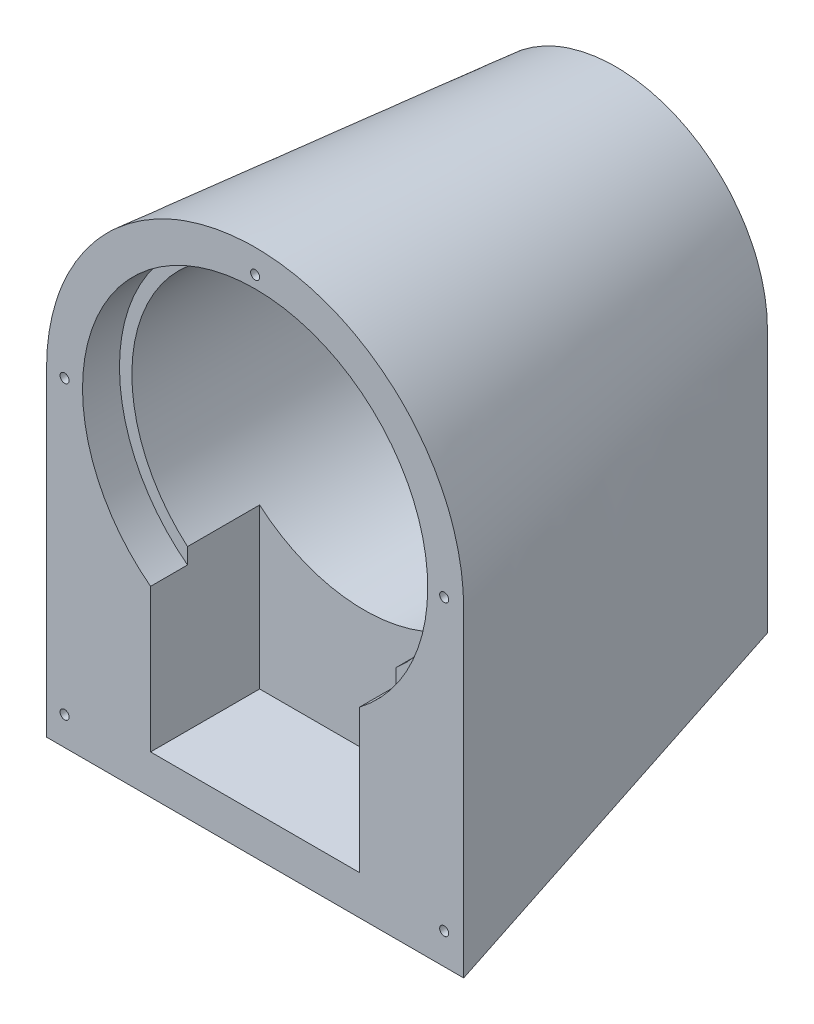
ISO-10303-21;
HEADER;
FILE_DESCRIPTION(('STEP AP214'),'2;1');
FILE_NAME('part.step','',(''),(''),'','','');
FILE_SCHEMA(('AUTOMOTIVE_DESIGN { 1 0 10303 214 1 1 1 1 }'));
ENDSEC;
DATA;
#1=APPLICATION_CONTEXT('core data for automotive mechanical design processes');
#2=APPLICATION_PROTOCOL_DEFINITION('international standard','automotive_design',2000,#1);
#3=PRODUCT_CONTEXT('',#1,'mechanical');
#4=PRODUCT('Part','Part','',(#3));
#5=PRODUCT_RELATED_PRODUCT_CATEGORY('part','',(#4));
#6=PRODUCT_DEFINITION_FORMATION('','',#4);
#7=PRODUCT_DEFINITION_CONTEXT('part definition',#1,'design');
#8=PRODUCT_DEFINITION('design','',#6,#7);
#9=PRODUCT_DEFINITION_SHAPE('','',#8);
#10=(LENGTH_UNIT() NAMED_UNIT(*) SI_UNIT(.MILLI.,.METRE.));
#11=(NAMED_UNIT(*) PLANE_ANGLE_UNIT() SI_UNIT($,.RADIAN.));
#12=(NAMED_UNIT(*) SI_UNIT($,.STERADIAN.) SOLID_ANGLE_UNIT());
#13=UNCERTAINTY_MEASURE_WITH_UNIT(LENGTH_MEASURE(1.E-05),#10,'distance_accuracy_value','');
#14=(GEOMETRIC_REPRESENTATION_CONTEXT(3) GLOBAL_UNCERTAINTY_ASSIGNED_CONTEXT((#13)) GLOBAL_UNIT_ASSIGNED_CONTEXT((#10,
#11,#12)) REPRESENTATION_CONTEXT('',''));
#15=CARTESIAN_POINT('',(0.,0.,0.));
#16=DIRECTION('',(0.,0.,1.));
#17=DIRECTION('',(1.,0.,0.));
#18=AXIS2_PLACEMENT_3D('',#15,#16,#17);
#19=CARTESIAN_POINT('',(0.,0.,-27.));
#20=DIRECTION('',(0.,0.,1.));
#21=DIRECTION('',(1.,0.,0.));
#22=AXIS2_PLACEMENT_3D('',#19,#20,#21);
#23=CYLINDRICAL_SURFACE('',#22,17.775);
#24=CARTESIAN_POINT('',(0.,0.,-4.1));
#25=DIRECTION('',(0.,0.,1.));
#26=DIRECTION('',(1.,0.,0.));
#27=AXIS2_PLACEMENT_3D('',#24,#25,#26);
#28=CIRCLE('',#27,17.775);
#29=CARTESIAN_POINT('',(-11.6,-13.4681336865952,-4.1));
#30=VERTEX_POINT('',#29);
#31=CARTESIAN_POINT('',(11.5397874396746,-13.519760754064,-4.1));
#32=VERTEX_POINT('',#31);
#33=EDGE_CURVE('E225',#30,#32,#28,.F.);
#34=ORIENTED_EDGE('',*,*,#33,.F.);
#35=DIRECTION('',(0.,0.,1.));
#36=VECTOR('',#35,1.);
#37=CARTESIAN_POINT('',(-11.6,-13.4681336865952,-27.));
#38=LINE('',#37,#36);
#39=CARTESIAN_POINT('',(-11.6,-13.4681336865952,-12.1));
#40=VERTEX_POINT('',#39);
#41=EDGE_CURVE('E205',#30,#40,#38,.F.);
#42=ORIENTED_EDGE('',*,*,#41,.T.);
#43=CARTESIAN_POINT('',(0.,0.,-12.1));
#44=DIRECTION('',(0.,0.,-1.));
#45=DIRECTION('',(-1.,0.,0.));
#46=AXIS2_PLACEMENT_3D('',#43,#44,#45);
#47=CIRCLE('',#46,17.775);
#48=CARTESIAN_POINT('',(11.5397874396746,-13.519760754064,-12.1));
#49=VERTEX_POINT('',#48);
#50=EDGE_CURVE('E11',#40,#49,#47,.F.);
#51=ORIENTED_EDGE('',*,*,#50,.T.);
#52=DIRECTION('',(0.,0.,1.));
#53=VECTOR('',#52,1.);
#54=CARTESIAN_POINT('',(11.5397874396746,-13.519760754064,-27.));
#55=LINE('',#54,#53);
#56=EDGE_CURVE('E202',#49,#32,#55,.T.);
#57=ORIENTED_EDGE('',*,*,#56,.T.);
#58=EDGE_LOOP('',(#34,#42,#51,#57));
#59=FACE_BOUND('',#58,.T.);
#60=CARTESIAN_POINT('',(0.,0.,-27.));
#61=DIRECTION('',(0.,0.,1.));
#62=DIRECTION('',(1.,0.,0.));
#63=AXIS2_PLACEMENT_3D('',#60,#61,#62);
#64=CIRCLE('',#63,17.775);
#65=CARTESIAN_POINT('',(17.775,0.,-27.));
#66=VERTEX_POINT('',#65);
#67=EDGE_CURVE('E271',#66,#66,#64,.T.);
#68=ORIENTED_EDGE('',*,*,#67,.F.);
#69=EDGE_LOOP('',(#68));
#70=FACE_BOUND('',#69,.T.);
#71=ADVANCED_FACE('F38',(#59,#70),#23,.F.);
#72=CARTESIAN_POINT('',(0.,0.,-39.));
#73=DIRECTION('',(0.,0.,-1.));
#74=DIRECTION('',(-1.,0.,0.));
#75=AXIS2_PLACEMENT_3D('',#72,#73,#74);
#76=PLANE('',#75);
#77=DIRECTION('',(0.,-1.,0.));
#78=VECTOR('',#77,1.);
#79=CARTESIAN_POINT('',(-4.5,2.5,-39.));
#80=LINE('',#79,#78);
#81=CARTESIAN_POINT('',(-4.5,2.5,-39.));
#82=VERTEX_POINT('',#81);
#83=CARTESIAN_POINT('',(-4.5,-1.5,-39.));
#84=VERTEX_POINT('',#83);
#85=EDGE_CURVE('E229',#82,#84,#80,.T.);
#86=ORIENTED_EDGE('',*,*,#85,.F.);
#87=DIRECTION('',(-1.,0.,0.));
#88=VECTOR('',#87,1.);
#89=CARTESIAN_POINT('',(9.1,2.5,-39.));
#90=LINE('',#89,#88);
#91=CARTESIAN_POINT('',(-9.1,2.5,-39.));
#92=VERTEX_POINT('',#91);
#93=EDGE_CURVE('E255',#82,#92,#90,.T.);
#94=ORIENTED_EDGE('',*,*,#93,.T.);
#95=DIRECTION('',(0.,-1.,0.));
#96=VECTOR('',#95,1.);
#97=CARTESIAN_POINT('',(-9.1,2.5,-39.));
#98=LINE('',#97,#96);
#99=CARTESIAN_POINT('',(-9.1,-2.5,-39.));
#100=VERTEX_POINT('',#99);
#101=EDGE_CURVE('E245',#92,#100,#98,.T.);
#102=ORIENTED_EDGE('',*,*,#101,.T.);
#103=DIRECTION('',(1.,0.,0.));
#104=VECTOR('',#103,1.);
#105=CARTESIAN_POINT('',(9.1,-2.5,-39.));
#106=LINE('',#105,#104);
#107=CARTESIAN_POINT('',(9.1,-2.5,-39.));
#108=VERTEX_POINT('',#107);
#109=EDGE_CURVE('E248',#100,#108,#106,.T.);
#110=ORIENTED_EDGE('',*,*,#109,.T.);
#111=DIRECTION('',(0.,1.,0.));
#112=VECTOR('',#111,1.);
#113=CARTESIAN_POINT('',(9.1,2.5,-39.));
#114=LINE('',#113,#112);
#115=CARTESIAN_POINT('',(9.1,2.5,-39.));
#116=VERTEX_POINT('',#115);
#117=EDGE_CURVE('E252',#108,#116,#114,.T.);
#118=ORIENTED_EDGE('',*,*,#117,.T.);
#119=CARTESIAN_POINT('',(4.5,2.5,-39.));
#120=VERTEX_POINT('',#119);
#121=EDGE_CURVE('E256',#116,#120,#90,.T.);
#122=ORIENTED_EDGE('',*,*,#121,.T.);
#123=DIRECTION('',(0.,1.,0.));
#124=VECTOR('',#123,1.);
#125=CARTESIAN_POINT('',(4.5,2.5,-39.));
#126=LINE('',#125,#124);
#127=CARTESIAN_POINT('',(4.5,-1.5,-39.));
#128=VERTEX_POINT('',#127);
#129=EDGE_CURVE('E233',#128,#120,#126,.T.);
#130=ORIENTED_EDGE('',*,*,#129,.F.);
#131=DIRECTION('',(1.,0.,0.));
#132=VECTOR('',#131,1.);
#133=CARTESIAN_POINT('',(4.5,-1.5,-39.));
#134=LINE('',#133,#132);
#135=EDGE_CURVE('E64',#84,#128,#134,.T.);
#136=ORIENTED_EDGE('',*,*,#135,.F.);
#137=EDGE_LOOP('',(#86,#94,#102,#110,#118,#122,#130,#136));
#138=FACE_BOUND('',#137,.T.);
#139=ADVANCED_FACE('F438',(#138),#76,.F.);
#140=CARTESIAN_POINT('',(0.,0.,0.));
#141=DIRECTION('',(0.,0.,1.));
#142=DIRECTION('',(1.,0.,0.));
#143=AXIS2_PLACEMENT_3D('',#140,#141,#142);
#144=PLANE('',#143);
#145=CARTESIAN_POINT('',(0.,20.5,0.));
#146=DIRECTION('',(0.,0.,1.));
#147=DIRECTION('',(1.,0.,0.));
#148=AXIS2_PLACEMENT_3D('',#145,#146,#147);
#149=CIRCLE('',#148,0.5);
#150=CARTESIAN_POINT('',(0.500000000000005,20.5,0.));
#151=VERTEX_POINT('',#150);
#152=EDGE_CURVE('E43',#151,#151,#149,.T.);
#153=ORIENTED_EDGE('',*,*,#152,.F.);
#154=EDGE_LOOP('',(#153));
#155=FACE_BOUND('',#154,.T.);
#156=CARTESIAN_POINT('',(-21.1408316826378,0.,0.));
#157=DIRECTION('',(0.,0.,1.));
#158=DIRECTION('',(1.,0.,0.));
#159=AXIS2_PLACEMENT_3D('',#156,#157,#158);
#160=CIRCLE('',#159,0.499999999999999);
#161=CARTESIAN_POINT('',(-20.6408316826378,0.,0.));
#162=VERTEX_POINT('',#161);
#163=EDGE_CURVE('E426',#162,#162,#160,.T.);
#164=ORIENTED_EDGE('',*,*,#163,.F.);
#165=EDGE_LOOP('',(#164));
#166=FACE_BOUND('',#165,.T.);
#167=CARTESIAN_POINT('',(20.9746954808096,0.,0.));
#168=DIRECTION('',(0.,0.,1.));
#169=DIRECTION('',(1.,0.,0.));
#170=AXIS2_PLACEMENT_3D('',#167,#168,#169);
#171=CIRCLE('',#170,0.499999999999999);
#172=CARTESIAN_POINT('',(21.4746954808096,0.,0.));
#173=VERTEX_POINT('',#172);
#174=EDGE_CURVE('E424',#173,#173,#171,.T.);
#175=ORIENTED_EDGE('',*,*,#174,.F.);
#176=EDGE_LOOP('',(#175));
#177=FACE_BOUND('',#176,.T.);
#178=CARTESIAN_POINT('',(-21.1408316826378,-32.3279733252439,0.));
#179=DIRECTION('',(0.,0.,1.));
#180=DIRECTION('',(1.,0.,0.));
#181=AXIS2_PLACEMENT_3D('',#178,#179,#180);
#182=CIRCLE('',#181,0.499999999999999);
#183=CARTESIAN_POINT('',(-20.6408316826378,-32.3279733252439,0.));
#184=VERTEX_POINT('',#183);
#185=EDGE_CURVE('E420',#184,#184,#182,.T.);
#186=ORIENTED_EDGE('',*,*,#185,.F.);
#187=EDGE_LOOP('',(#186));
#188=FACE_BOUND('',#187,.T.);
#189=CARTESIAN_POINT('',(20.9746954808096,-32.0642603339644,0.));
#190=DIRECTION('',(0.,0.,1.));
#191=DIRECTION('',(1.,0.,0.));
#192=AXIS2_PLACEMENT_3D('',#189,#190,#191);
#193=CIRCLE('',#192,0.499999999999999);
#194=CARTESIAN_POINT('',(21.4746954808096,-32.0642603339644,0.));
#195=VERTEX_POINT('',#194);
#196=EDGE_CURVE('E417',#195,#195,#193,.T.);
#197=ORIENTED_EDGE('',*,*,#196,.F.);
#198=EDGE_LOOP('',(#197));
#199=FACE_BOUND('',#198,.T.);
#200=DIRECTION('',(0.,-1.,0.));
#201=VECTOR('',#200,1.);
#202=CARTESIAN_POINT('',(-11.6,-15.2368796018082,0.));
#203=LINE('',#202,#201);
#204=CARTESIAN_POINT('',(-11.6,-15.2368796018082,0.));
#205=VERTEX_POINT('',#204);
#206=CARTESIAN_POINT('',(-11.6,-31.15,0.));
#207=VERTEX_POINT('',#206);
#208=EDGE_CURVE('E56',#205,#207,#203,.T.);
#209=ORIENTED_EDGE('',*,*,#208,.F.);
#210=CARTESIAN_POINT('',(0.,0.,0.));
#211=DIRECTION('',(0.,0.,1.));
#212=DIRECTION('',(1.,0.,0.));
#213=AXIS2_PLACEMENT_3D('',#210,#211,#212);
#214=CIRCLE('',#213,19.15);
#215=CARTESIAN_POINT('',(11.6,-15.2368796018082,0.));
#216=VERTEX_POINT('',#215);
#217=EDGE_CURVE('E210',#216,#205,#214,.T.);
#218=ORIENTED_EDGE('',*,*,#217,.F.);
#219=DIRECTION('',(0.,1.,0.));
#220=VECTOR('',#219,1.);
#221=CARTESIAN_POINT('',(11.6,-15.2368796018082,0.));
#222=LINE('',#221,#220);
#223=CARTESIAN_POINT('',(11.6,-31.15,0.));
#224=VERTEX_POINT('',#223);
#225=EDGE_CURVE('E218',#224,#216,#222,.T.);
#226=ORIENTED_EDGE('',*,*,#225,.F.);
#227=DIRECTION('',(1.,0.,0.));
#228=VECTOR('',#227,1.);
#229=CARTESIAN_POINT('',(11.6,-31.15,0.));
#230=LINE('',#229,#228);
#231=EDGE_CURVE('E216',#207,#224,#230,.T.);
#232=ORIENTED_EDGE('',*,*,#231,.F.);
#233=EDGE_LOOP('',(#209,#218,#226,#232));
#234=FACE_BOUND('',#233,.T.);
#235=DIRECTION('',(0.,1.,0.));
#236=VECTOR('',#235,1.);
#237=CARTESIAN_POINT('',(23.1391726111028,-35.5,0.));
#238=LINE('',#237,#236);
#239=CARTESIAN_POINT('',(23.1391726111028,-35.5,0.));
#240=VERTEX_POINT('',#239);
#241=CARTESIAN_POINT('',(23.1391726111028,3.593884949195E-11,0.));
#242=VERTEX_POINT('',#241);
#243=EDGE_CURVE('E391',#240,#242,#238,.T.);
#244=ORIENTED_EDGE('',*,*,#243,.T.);
#245=CARTESIAN_POINT('',(0.,0.,0.));
#246=DIRECTION('',(0.,0.,1.));
#247=DIRECTION('',(1.,0.,0.));
#248=AXIS2_PLACEMENT_3D('',#245,#246,#247);
#249=CIRCLE('',#248,23.1391726111028);
#250=CARTESIAN_POINT('',(-23.1391726111028,0.,0.));
#251=VERTEX_POINT('',#250);
#252=EDGE_CURVE('E385',#242,#251,#249,.T.);
#253=ORIENTED_EDGE('',*,*,#252,.T.);
#254=DIRECTION('',(0.,-1.,0.));
#255=VECTOR('',#254,1.);
#256=CARTESIAN_POINT('',(-23.1391726111028,0.,0.));
#257=LINE('',#256,#255);
#258=CARTESIAN_POINT('',(-23.1391726111028,-35.5,0.));
#259=VERTEX_POINT('',#258);
#260=EDGE_CURVE('E369',#251,#259,#257,.T.);
#261=ORIENTED_EDGE('',*,*,#260,.T.);
#262=DIRECTION('',(1.,0.,0.));
#263=VECTOR('',#262,1.);
#264=CARTESIAN_POINT('',(-23.1391726111028,-35.5,0.));
#265=LINE('',#264,#263);
#266=EDGE_CURVE('E365',#259,#240,#265,.T.);
#267=ORIENTED_EDGE('',*,*,#266,.T.);
#268=EDGE_LOOP('',(#244,#253,#261,#267));
#269=FACE_BOUND('',#268,.T.);
#270=ADVANCED_FACE('F40',(#155,#166,#177,#188,#199,#234,#269),#144,.T.);
#271=CARTESIAN_POINT('',(0.,3.66071428571428,-40.));
#272=DIRECTION('',(0.,0.,1.));
#273=DIRECTION('',(1.,0.,0.));
#274=AXIS2_PLACEMENT_3D('',#271,#272,#273);
#275=PLANE('',#274);
#276=DIRECTION('',(-1.,0.,0.));
#277=VECTOR('',#276,1.);
#278=CARTESIAN_POINT('',(0.,2.5,-40.));
#279=LINE('',#278,#277);
#280=CARTESIAN_POINT('',(4.5,2.5,-40.));
#281=VERTEX_POINT('',#280);
#282=CARTESIAN_POINT('',(-4.5,2.5,-40.));
#283=VERTEX_POINT('',#282);
#284=EDGE_CURVE('E410',#281,#283,#279,.T.);
#285=ORIENTED_EDGE('',*,*,#284,.T.);
#286=DIRECTION('',(0.,-1.,0.));
#287=VECTOR('',#286,1.);
#288=CARTESIAN_POINT('',(-4.5,3.66071428571428,-40.));
#289=LINE('',#288,#287);
#290=CARTESIAN_POINT('',(-4.5,-1.5,-40.));
#291=VERTEX_POINT('',#290);
#292=EDGE_CURVE('E48',#283,#291,#289,.T.);
#293=ORIENTED_EDGE('',*,*,#292,.T.);
#294=DIRECTION('',(1.,0.,0.));
#295=VECTOR('',#294,1.);
#296=CARTESIAN_POINT('',(0.,-1.5,-40.));
#297=LINE('',#296,#295);
#298=CARTESIAN_POINT('',(4.5,-1.5,-40.));
#299=VERTEX_POINT('',#298);
#300=EDGE_CURVE('E368',#291,#299,#297,.T.);
#301=ORIENTED_EDGE('',*,*,#300,.T.);
#302=DIRECTION('',(0.,1.,0.));
#303=VECTOR('',#302,1.);
#304=CARTESIAN_POINT('',(4.5,3.66071428571428,-40.));
#305=LINE('',#304,#303);
#306=EDGE_CURVE('E407',#299,#281,#305,.T.);
#307=ORIENTED_EDGE('',*,*,#306,.T.);
#308=EDGE_LOOP('',(#285,#293,#301,#307));
#309=FACE_BOUND('',#308,.T.);
#310=DIRECTION('',(1.,0.,0.));
#311=VECTOR('',#310,1.);
#312=CARTESIAN_POINT('',(-16.8392857142857,-25.5,-40.));
#313=LINE('',#312,#311);
#314=CARTESIAN_POINT('',(-16.8392857142857,-25.5,-40.));
#315=VERTEX_POINT('',#314);
#316=CARTESIAN_POINT('',(16.8392857142857,-25.5,-40.));
#317=VERTEX_POINT('',#316);
#318=EDGE_CURVE('E280',#315,#317,#313,.T.);
#319=ORIENTED_EDGE('',*,*,#318,.F.);
#320=DIRECTION('',(0.,-1.,0.));
#321=VECTOR('',#320,1.);
#322=CARTESIAN_POINT('',(-16.8392857142857,3.66071428571428,-40.));
#323=LINE('',#322,#321);
#324=CARTESIAN_POINT('',(-16.8392857142857,3.66071428571429,-40.));
#325=VERTEX_POINT('',#324);
#326=EDGE_CURVE('E285',#325,#315,#323,.T.);
#327=ORIENTED_EDGE('',*,*,#326,.F.);
#328=CARTESIAN_POINT('',(0.,3.66071428571428,-40.));
#329=DIRECTION('',(0.,0.,1.));
#330=DIRECTION('',(1.,0.,0.));
#331=AXIS2_PLACEMENT_3D('',#328,#329,#330);
#332=CIRCLE('',#331,16.8392857142857);
#333=CARTESIAN_POINT('',(16.8392857142857,3.66071428571428,-40.));
#334=VERTEX_POINT('',#333);
#335=EDGE_CURVE('E326',#334,#325,#332,.T.);
#336=ORIENTED_EDGE('',*,*,#335,.F.);
#337=DIRECTION('',(0.,1.,0.));
#338=VECTOR('',#337,1.);
#339=CARTESIAN_POINT('',(16.8392857142857,-25.5,-40.));
#340=LINE('',#339,#338);
#341=EDGE_CURVE('E345',#317,#334,#340,.T.);
#342=ORIENTED_EDGE('',*,*,#341,.F.);
#343=EDGE_LOOP('',(#319,#327,#336,#342));
#344=FACE_BOUND('',#343,.T.);
#345=ADVANCED_FACE('F304',(#309,#344),#275,.F.);
#346=CARTESIAN_POINT('',(-16.8392857142857,3.66071428571429,-40.));
#347=DIRECTION('',(-0.987823391647072,0.,-0.155579391035169));
#348=DIRECTION('',(0.,-1.,0.));
#349=AXIS2_PLACEMENT_3D('',#346,#347,#348);
#350=PLANE('',#349);
#351=ORIENTED_EDGE('',*,*,#326,.T.);
#352=DIRECTION('',(-0.151041745852426,-0.239753107200604,0.959012428802415));
#353=VECTOR('',#352,1.);
#354=CARTESIAN_POINT('',(-19.9892291626942,-30.5,-20.));
#355=LINE('',#354,#353);
#356=EDGE_CURVE('E846',#315,#259,#355,.T.);
#357=ORIENTED_EDGE('',*,*,#356,.T.);
#358=ORIENTED_EDGE('',*,*,#260,.F.);
#359=DIRECTION('',(0.154947502841091,0.0900363048537773,-0.983811331085177));
#360=VECTOR('',#359,1.);
#361=CARTESIAN_POINT('',(-19.9892291626942,1.83035714285714,-20.));
#362=LINE('',#361,#360);
#363=EDGE_CURVE('E291',#251,#325,#362,.T.);
#364=ORIENTED_EDGE('',*,*,#363,.T.);
#365=EDGE_LOOP('',(#351,#357,#358,#364));
#366=FACE_BOUND('',#365,.T.);
#367=ADVANCED_FACE('F293',(#366),#350,.T.);
#368=CARTESIAN_POINT('',(-16.8392857142857,-25.5,-40.));
#369=DIRECTION('',(0.,-0.970142500145332,-0.242535625036333));
#370=DIRECTION('',(1.,0.,0.));
#371=AXIS2_PLACEMENT_3D('',#368,#369,#370);
#372=PLANE('',#371);
#373=ORIENTED_EDGE('',*,*,#318,.T.);
#374=DIRECTION('',(0.151041745852426,-0.239753107200604,0.959012428802415));
#375=VECTOR('',#374,1.);
#376=CARTESIAN_POINT('',(19.9892291626942,-30.5,-20.));
#377=LINE('',#376,#375);
#378=EDGE_CURVE('E845',#317,#240,#377,.T.);
#379=ORIENTED_EDGE('',*,*,#378,.T.);
#380=ORIENTED_EDGE('',*,*,#266,.F.);
#381=ORIENTED_EDGE('',*,*,#356,.F.);
#382=EDGE_LOOP('',(#373,#379,#380,#381));
#383=FACE_BOUND('',#382,.T.);
#384=ADVANCED_FACE('F303',(#383),#372,.T.);
#385=CARTESIAN_POINT('',(16.8392857142857,-25.5,-40.));
#386=CARTESIAN_POINT('',(23.1391726111028,-35.5,0.));
#387=CARTESIAN_POINT('',(16.8392857142857,-23.1633133220628,-40.));
#388=CARTESIAN_POINT('',(23.1391726111028,-32.4192513558968,0.));
#389=CARTESIAN_POINT('',(16.8392857142857,-18.3581769551092,-40.));
#390=CARTESIAN_POINT('',(23.1391726111027,-26.4521571775621,0.));
#391=CARTESIAN_POINT('',(16.8392857142857,-10.9196428571428,-40.));
#392=CARTESIAN_POINT('',(23.1391726111028,-17.75,0.));
#393=CARTESIAN_POINT('',(16.8392857142857,-3.4811087591765,-40.));
#394=CARTESIAN_POINT('',(23.1391726111027,-9.04784282243799,0.));
#395=CARTESIAN_POINT('',(16.8392857142857,1.32402760777705,-40.));
#396=CARTESIAN_POINT('',(23.1391726111028,-3.08074864410315,0.));
#397=CARTESIAN_POINT('',(16.8392857142857,4.78618616094492,-40.));
#398=CARTESIAN_POINT('',(23.1391726111028,1.48385146640792,0.));
#399=CARTESIAN_POINT('',(16.6112761465603,7.02719833815416,-40.));
#400=CARTESIAN_POINT('',(22.8515585744662,4.46240102524375,0.));
#401=CARTESIAN_POINT('',(15.2950494211759,11.3043060945489,-39.9999999999999));
#402=CARTESIAN_POINT('',(21.1349835961836,10.2379591634769,0.));
#403=CARTESIAN_POINT('',(12.1340593101357,15.9567403468435,-40.0000000000002));
#404=CARTESIAN_POINT('',(16.9026911998515,16.679187275624,0.));
#405=CARTESIAN_POINT('',(6.54452874488161,19.6428889762175,-39.9999999999999));
#406=CARTESIAN_POINT('',(9.18003118325428,21.9080542952771,0.));
#407=CARTESIAN_POINT('',(0.,20.9292967050765,-40.));
#408=CARTESIAN_POINT('',(0.,23.7560940098963,0.));
#409=CARTESIAN_POINT('',(-6.54452874488165,19.6428889762175,-40.));
#410=CARTESIAN_POINT('',(-9.18003118325423,21.908054295277,0.));
#411=CARTESIAN_POINT('',(-12.1340593101357,15.9567403468435,-40.));
#412=CARTESIAN_POINT('',(-16.9026911998515,16.679187275624,0.));
#413=CARTESIAN_POINT('',(-15.2950494211759,11.3043060945489,-40.));
#414=CARTESIAN_POINT('',(-21.1349835961836,10.2379591634768,0.));
#415=CARTESIAN_POINT('',(-16.6112761465603,7.02719833815416,-40.));
#416=CARTESIAN_POINT('',(-22.8515585744662,4.46240102524377,0.));
#417=CARTESIAN_POINT('',(-16.8392857142857,4.78618616094493,-40.));
#418=CARTESIAN_POINT('',(-23.1391726111028,1.48385146640792,0.));
#419=CARTESIAN_POINT('',(-16.8392857142857,3.66071428571429,-40.));
#420=CARTESIAN_POINT('',(-23.1391726111028,0.,0.));
#421=B_SPLINE_SURFACE_WITH_KNOTS('',3,1,((#385,#386),(#387,#388),(#389,#390),(#391,#392),(#393,
#394),(#395,#396),(#397,#398),(#399,#400),(#401,#402),(#403,#404),(#405,#406),(#407,#408),(#409,
#410),(#411,#412),(#413,#414),(#415,#416),(#417,#418),(#419,#420)),.UNSPECIFIED.,.F.,.F.,.F.,(4,
1,1,1,2,1,1,1,1,1,1,1,1,1,4),(2,2),(0.,0.0854230211059748,0.17084604221195,0.256269063317924,
0.341692084423899,0.382836329147405,0.423980573870912,0.506269063317924,0.588557552764937,
0.670846042211949,0.753134531658962,0.835423021105975,0.917711510552987,0.958855755276494,1.),
(0.,1.),.UNSPECIFIED.);
#422=ORIENTED_EDGE('',*,*,#341,.T.);
#423=ORIENTED_EDGE('',*,*,#335,.T.);
#424=ORIENTED_EDGE('',*,*,#363,.F.);
#425=ORIENTED_EDGE('',*,*,#252,.F.);
#426=ORIENTED_EDGE('',*,*,#243,.F.);
#427=ORIENTED_EDGE('',*,*,#378,.F.);
#428=EDGE_LOOP('',(#422,#423,#424,#425,#426,#427));
#429=FACE_BOUND('',#428,.T.);
#430=ADVANCED_FACE('F488',(#429),#421,.T.);
#431=CARTESIAN_POINT('',(0.,0.,-27.));
#432=DIRECTION('',(0.,0.,1.));
#433=DIRECTION('',(1.,0.,0.));
#434=AXIS2_PLACEMENT_3D('',#431,#432,#433);
#435=PLANE('',#434);
#436=DIRECTION('',(0.,-1.,0.));
#437=VECTOR('',#436,1.);
#438=CARTESIAN_POINT('',(-9.1,2.5,-27.));
#439=LINE('',#438,#437);
#440=CARTESIAN_POINT('',(-9.1,2.5,-27.));
#441=VERTEX_POINT('',#440);
#442=CARTESIAN_POINT('',(-9.1,-2.5,-27.));
#443=VERTEX_POINT('',#442);
#444=EDGE_CURVE('E239',#441,#443,#439,.T.);
#445=ORIENTED_EDGE('',*,*,#444,.F.);
#446=DIRECTION('',(-1.,0.,0.));
#447=VECTOR('',#446,1.);
#448=CARTESIAN_POINT('',(9.1,2.5,-27.));
#449=LINE('',#448,#447);
#450=CARTESIAN_POINT('',(9.1,2.5,-27.));
#451=VERTEX_POINT('',#450);
#452=EDGE_CURVE('E249',#451,#441,#449,.T.);
#453=ORIENTED_EDGE('',*,*,#452,.F.);
#454=DIRECTION('',(0.,1.,0.));
#455=VECTOR('',#454,1.);
#456=CARTESIAN_POINT('',(9.1,2.5,-27.));
#457=LINE('',#456,#455);
#458=CARTESIAN_POINT('',(9.1,-2.5,-27.));
#459=VERTEX_POINT('',#458);
#460=EDGE_CURVE('E265',#459,#451,#457,.T.);
#461=ORIENTED_EDGE('',*,*,#460,.F.);
#462=DIRECTION('',(1.,0.,0.));
#463=VECTOR('',#462,1.);
#464=CARTESIAN_POINT('',(9.1,-2.5,-27.));
#465=LINE('',#464,#463);
#466=EDGE_CURVE('E262',#443,#459,#465,.T.);
#467=ORIENTED_EDGE('',*,*,#466,.F.);
#468=EDGE_LOOP('',(#445,#453,#461,#467));
#469=FACE_BOUND('',#468,.T.);
#470=ORIENTED_EDGE('',*,*,#67,.T.);
#471=EDGE_LOOP('',(#470));
#472=FACE_BOUND('',#471,.T.);
#473=ADVANCED_FACE('F484',(#469,#472),#435,.T.);
#474=CARTESIAN_POINT('',(-9.1,2.5,-39.));
#475=DIRECTION('',(-1.,0.,0.));
#476=DIRECTION('',(0.,0.,1.));
#477=AXIS2_PLACEMENT_3D('',#474,#475,#476);
#478=PLANE('',#477);
#479=ORIENTED_EDGE('',*,*,#444,.T.);
#480=DIRECTION('',(0.,0.,1.));
#481=VECTOR('',#480,1.);
#482=CARTESIAN_POINT('',(-9.1,-2.5,-39.));
#483=LINE('',#482,#481);
#484=EDGE_CURVE('E259',#100,#443,#483,.T.);
#485=ORIENTED_EDGE('',*,*,#484,.F.);
#486=ORIENTED_EDGE('',*,*,#101,.F.);
#487=DIRECTION('',(0.,0.,1.));
#488=VECTOR('',#487,1.);
#489=CARTESIAN_POINT('',(-9.1,2.5,-39.));
#490=LINE('',#489,#488);
#491=EDGE_CURVE('E269',#92,#441,#490,.T.);
#492=ORIENTED_EDGE('',*,*,#491,.T.);
#493=EDGE_LOOP('',(#479,#485,#486,#492));
#494=FACE_BOUND('',#493,.T.);
#495=ADVANCED_FACE('F487',(#494),#478,.F.);
#496=CARTESIAN_POINT('',(9.1,2.5,-39.));
#497=DIRECTION('',(0.,1.,0.));
#498=DIRECTION('',(-1.,0.,0.));
#499=AXIS2_PLACEMENT_3D('',#496,#497,#498);
#500=PLANE('',#499);
#501=ORIENTED_EDGE('',*,*,#452,.T.);
#502=ORIENTED_EDGE('',*,*,#491,.F.);
#503=ORIENTED_EDGE('',*,*,#93,.F.);
#504=DIRECTION('',(0.,0.,1.));
#505=VECTOR('',#504,1.);
#506=CARTESIAN_POINT('',(-4.5,2.5,-51.));
#507=LINE('',#506,#505);
#508=EDGE_CURVE('E237',#283,#82,#507,.T.);
#509=ORIENTED_EDGE('',*,*,#508,.F.);
#510=ORIENTED_EDGE('',*,*,#284,.F.);
#511=DIRECTION('',(0.,0.,1.));
#512=VECTOR('',#511,1.);
#513=CARTESIAN_POINT('',(4.5,2.5,-51.));
#514=LINE('',#513,#512);
#515=EDGE_CURVE('E240',#281,#120,#514,.T.);
#516=ORIENTED_EDGE('',*,*,#515,.T.);
#517=ORIENTED_EDGE('',*,*,#121,.F.);
#518=DIRECTION('',(0.,0.,1.));
#519=VECTOR('',#518,1.);
#520=CARTESIAN_POINT('',(9.1,2.5,-39.));
#521=LINE('',#520,#519);
#522=EDGE_CURVE('E272',#116,#451,#521,.T.);
#523=ORIENTED_EDGE('',*,*,#522,.T.);
#524=EDGE_LOOP('',(#501,#502,#503,#509,#510,#516,#517,#523));
#525=FACE_BOUND('',#524,.T.);
#526=ADVANCED_FACE('F492',(#525),#500,.F.);
#527=CARTESIAN_POINT('',(9.1,2.5,-39.));
#528=DIRECTION('',(1.,0.,0.));
#529=DIRECTION('',(0.,0.,-1.));
#530=AXIS2_PLACEMENT_3D('',#527,#528,#529);
#531=PLANE('',#530);
#532=ORIENTED_EDGE('',*,*,#460,.T.);
#533=ORIENTED_EDGE('',*,*,#522,.F.);
#534=ORIENTED_EDGE('',*,*,#117,.F.);
#535=DIRECTION('',(0.,0.,1.));
#536=VECTOR('',#535,1.);
#537=CARTESIAN_POINT('',(9.1,-2.5,-39.));
#538=LINE('',#537,#536);
#539=EDGE_CURVE('E275',#108,#459,#538,.T.);
#540=ORIENTED_EDGE('',*,*,#539,.T.);
#541=EDGE_LOOP('',(#532,#533,#534,#540));
#542=FACE_BOUND('',#541,.T.);
#543=ADVANCED_FACE('F498',(#542),#531,.F.);
#544=CARTESIAN_POINT('',(9.1,-2.5,-39.));
#545=DIRECTION('',(0.,-1.,0.));
#546=DIRECTION('',(1.,0.,0.));
#547=AXIS2_PLACEMENT_3D('',#544,#545,#546);
#548=PLANE('',#547);
#549=ORIENTED_EDGE('',*,*,#466,.T.);
#550=ORIENTED_EDGE('',*,*,#539,.F.);
#551=ORIENTED_EDGE('',*,*,#109,.F.);
#552=ORIENTED_EDGE('',*,*,#484,.T.);
#553=EDGE_LOOP('',(#549,#550,#551,#552));
#554=FACE_BOUND('',#553,.T.);
#555=ADVANCED_FACE('F494',(#554),#548,.F.);
#556=CARTESIAN_POINT('',(-4.5,2.5,-51.));
#557=DIRECTION('',(-1.,0.,0.));
#558=DIRECTION('',(0.,0.,1.));
#559=AXIS2_PLACEMENT_3D('',#556,#557,#558);
#560=PLANE('',#559);
#561=ORIENTED_EDGE('',*,*,#508,.T.);
#562=ORIENTED_EDGE('',*,*,#85,.T.);
#563=DIRECTION('',(0.,0.,1.));
#564=VECTOR('',#563,1.);
#565=CARTESIAN_POINT('',(-4.5,-1.5,-51.));
#566=LINE('',#565,#564);
#567=EDGE_CURVE('E236',#291,#84,#566,.T.);
#568=ORIENTED_EDGE('',*,*,#567,.F.);
#569=ORIENTED_EDGE('',*,*,#292,.F.);
#570=EDGE_LOOP('',(#561,#562,#568,#569));
#571=FACE_BOUND('',#570,.T.);
#572=ADVANCED_FACE('F497',(#571),#560,.F.);
#573=CARTESIAN_POINT('',(4.5,2.5,-51.));
#574=DIRECTION('',(1.,0.,0.));
#575=DIRECTION('',(0.,0.,-1.));
#576=AXIS2_PLACEMENT_3D('',#573,#574,#575);
#577=PLANE('',#576);
#578=DIRECTION('',(0.,0.,1.));
#579=VECTOR('',#578,1.);
#580=CARTESIAN_POINT('',(4.5,-1.5,-51.));
#581=LINE('',#580,#579);
#582=EDGE_CURVE('E242',#299,#128,#581,.T.);
#583=ORIENTED_EDGE('',*,*,#582,.T.);
#584=ORIENTED_EDGE('',*,*,#129,.T.);
#585=ORIENTED_EDGE('',*,*,#515,.F.);
#586=ORIENTED_EDGE('',*,*,#306,.F.);
#587=EDGE_LOOP('',(#583,#584,#585,#586));
#588=FACE_BOUND('',#587,.T.);
#589=ADVANCED_FACE('F508',(#588),#577,.F.);
#590=CARTESIAN_POINT('',(4.5,-1.5,-51.));
#591=DIRECTION('',(0.,-1.,0.));
#592=DIRECTION('',(0.,0.,-1.));
#593=AXIS2_PLACEMENT_3D('',#590,#591,#592);
#594=PLANE('',#593);
#595=ORIENTED_EDGE('',*,*,#567,.T.);
#596=ORIENTED_EDGE('',*,*,#135,.T.);
#597=ORIENTED_EDGE('',*,*,#582,.F.);
#598=ORIENTED_EDGE('',*,*,#300,.F.);
#599=EDGE_LOOP('',(#595,#596,#597,#598));
#600=FACE_BOUND('',#599,.T.);
#601=ADVANCED_FACE('F510',(#600),#594,.F.);
#602=CARTESIAN_POINT('',(0.,0.,-4.1));
#603=DIRECTION('',(0.,0.,1.));
#604=DIRECTION('',(1.,0.,0.));
#605=AXIS2_PLACEMENT_3D('',#602,#603,#604);
#606=PLANE('',#605);
#607=DIRECTION('',(0.,-1.,0.));
#608=VECTOR('',#607,1.);
#609=CARTESIAN_POINT('',(-11.6,-31.15,-4.1));
#610=LINE('',#609,#608);
#611=CARTESIAN_POINT('',(-11.6,-15.2368796018082,-4.1));
#612=VERTEX_POINT('',#611);
#613=EDGE_CURVE('E198',#30,#612,#610,.T.);
#614=ORIENTED_EDGE('',*,*,#613,.F.);
#615=ORIENTED_EDGE('',*,*,#33,.T.);
#616=DIRECTION('',(0.,1.,0.));
#617=VECTOR('',#616,1.);
#618=CARTESIAN_POINT('',(11.5397874396746,-31.15,-4.1));
#619=LINE('',#618,#617);
#620=CARTESIAN_POINT('',(11.5397874396746,-31.15,-4.1));
#621=VERTEX_POINT('',#620);
#622=EDGE_CURVE('E187',#621,#32,#619,.T.);
#623=ORIENTED_EDGE('',*,*,#622,.F.);
#624=DIRECTION('',(1.,0.,0.));
#625=VECTOR('',#624,1.);
#626=CARTESIAN_POINT('',(11.6,-31.15,-4.1));
#627=LINE('',#626,#625);
#628=CARTESIAN_POINT('',(11.6,-31.15,-4.1));
#629=VERTEX_POINT('',#628);
#630=EDGE_CURVE('E207',#621,#629,#627,.T.);
#631=ORIENTED_EDGE('',*,*,#630,.T.);
#632=DIRECTION('',(0.,1.,0.));
#633=VECTOR('',#632,1.);
#634=CARTESIAN_POINT('',(11.6,-15.2368796018082,-4.1));
#635=LINE('',#634,#633);
#636=CARTESIAN_POINT('',(11.6,-15.2368796018082,-4.1));
#637=VERTEX_POINT('',#636);
#638=EDGE_CURVE('E209',#629,#637,#635,.T.);
#639=ORIENTED_EDGE('',*,*,#638,.T.);
#640=CARTESIAN_POINT('',(0.,0.,-4.1));
#641=DIRECTION('',(0.,0.,1.));
#642=DIRECTION('',(1.,0.,0.));
#643=AXIS2_PLACEMENT_3D('',#640,#641,#642);
#644=CIRCLE('',#643,19.15);
#645=EDGE_CURVE('E180',#637,#612,#644,.T.);
#646=ORIENTED_EDGE('',*,*,#645,.T.);
#647=EDGE_LOOP('',(#614,#615,#623,#631,#639,#646));
#648=FACE_BOUND('',#647,.T.);
#649=ADVANCED_FACE('F455',(#648),#606,.T.);
#650=CARTESIAN_POINT('',(-11.6,-15.2368796018082,-4.1));
#651=DIRECTION('',(-1.,0.,0.));
#652=DIRECTION('',(0.,0.,1.));
#653=AXIS2_PLACEMENT_3D('',#650,#651,#652);
#654=PLANE('',#653);
#655=ORIENTED_EDGE('',*,*,#208,.T.);
#656=DIRECTION('',(0.,0.,1.));
#657=VECTOR('',#656,1.);
#658=CARTESIAN_POINT('',(-11.6,-31.15,-4.1));
#659=LINE('',#658,#657);
#660=CARTESIAN_POINT('',(-11.6,-31.15,-12.1));
#661=VERTEX_POINT('',#660);
#662=EDGE_CURVE('E170',#661,#207,#659,.T.);
#663=ORIENTED_EDGE('',*,*,#662,.F.);
#664=DIRECTION('',(0.,-1.,0.));
#665=VECTOR('',#664,1.);
#666=CARTESIAN_POINT('',(-11.6,-31.15,-12.1));
#667=LINE('',#666,#665);
#668=EDGE_CURVE('E173',#40,#661,#667,.T.);
#669=ORIENTED_EDGE('',*,*,#668,.F.);
#670=ORIENTED_EDGE('',*,*,#41,.F.);
#671=ORIENTED_EDGE('',*,*,#613,.T.);
#672=DIRECTION('',(0.,0.,1.));
#673=VECTOR('',#672,1.);
#674=CARTESIAN_POINT('',(-11.6,-15.2368796018082,-4.1));
#675=LINE('',#674,#673);
#676=EDGE_CURVE('E223',#612,#205,#675,.T.);
#677=ORIENTED_EDGE('',*,*,#676,.T.);
#678=EDGE_LOOP('',(#655,#663,#669,#670,#671,#677));
#679=FACE_BOUND('',#678,.T.);
#680=ADVANCED_FACE('F172',(#679),#654,.F.);
#681=CARTESIAN_POINT('',(0.,0.,-4.1));
#682=DIRECTION('',(0.,0.,1.));
#683=DIRECTION('',(1.,0.,0.));
#684=AXIS2_PLACEMENT_3D('',#681,#682,#683);
#685=CYLINDRICAL_SURFACE('',#684,19.15);
#686=ORIENTED_EDGE('',*,*,#217,.T.);
#687=ORIENTED_EDGE('',*,*,#676,.F.);
#688=ORIENTED_EDGE('',*,*,#645,.F.);
#689=DIRECTION('',(0.,0.,1.));
#690=VECTOR('',#689,1.);
#691=CARTESIAN_POINT('',(11.6,-15.2368796018082,-4.1));
#692=LINE('',#691,#690);
#693=EDGE_CURVE('E226',#637,#216,#692,.T.);
#694=ORIENTED_EDGE('',*,*,#693,.T.);
#695=EDGE_LOOP('',(#686,#687,#688,#694));
#696=FACE_BOUND('',#695,.T.);
#697=ADVANCED_FACE('F459',(#696),#685,.F.);
#698=CARTESIAN_POINT('',(11.6,-15.2368796018082,-4.1));
#699=DIRECTION('',(1.,0.,0.));
#700=DIRECTION('',(0.,0.,-1.));
#701=AXIS2_PLACEMENT_3D('',#698,#699,#700);
#702=PLANE('',#701);
#703=ORIENTED_EDGE('',*,*,#225,.T.);
#704=ORIENTED_EDGE('',*,*,#693,.F.);
#705=ORIENTED_EDGE('',*,*,#638,.F.);
#706=DIRECTION('',(0.,0.,1.));
#707=VECTOR('',#706,1.);
#708=CARTESIAN_POINT('',(11.6,-31.15,-4.1));
#709=LINE('',#708,#707);
#710=EDGE_CURVE('E179',#629,#224,#709,.T.);
#711=ORIENTED_EDGE('',*,*,#710,.T.);
#712=EDGE_LOOP('',(#703,#704,#705,#711));
#713=FACE_BOUND('',#712,.T.);
#714=ADVANCED_FACE('F451',(#713),#702,.F.);
#715=CARTESIAN_POINT('',(11.6,-31.15,-4.1));
#716=DIRECTION('',(0.,-1.,0.));
#717=DIRECTION('',(0.,0.,-1.));
#718=AXIS2_PLACEMENT_3D('',#715,#716,#717);
#719=PLANE('',#718);
#720=ORIENTED_EDGE('',*,*,#231,.T.);
#721=ORIENTED_EDGE('',*,*,#710,.F.);
#722=ORIENTED_EDGE('',*,*,#630,.F.);
#723=DIRECTION('',(0.,0.,1.));
#724=VECTOR('',#723,1.);
#725=CARTESIAN_POINT('',(11.5397874396746,-31.15,-12.1));
#726=LINE('',#725,#724);
#727=CARTESIAN_POINT('',(11.5397874396746,-31.15,-12.1));
#728=VERTEX_POINT('',#727);
#729=EDGE_CURVE('E191',#728,#621,#726,.T.);
#730=ORIENTED_EDGE('',*,*,#729,.F.);
#731=DIRECTION('',(1.,0.,0.));
#732=VECTOR('',#731,1.);
#733=CARTESIAN_POINT('',(-11.6,-31.15,-12.1));
#734=LINE('',#733,#732);
#735=EDGE_CURVE('E186',#661,#728,#734,.T.);
#736=ORIENTED_EDGE('',*,*,#735,.F.);
#737=ORIENTED_EDGE('',*,*,#662,.T.);
#738=EDGE_LOOP('',(#720,#721,#722,#730,#736,#737));
#739=FACE_BOUND('',#738,.T.);
#740=ADVANCED_FACE('F189',(#739),#719,.F.);
#741=CARTESIAN_POINT('',(0.,0.,-12.1));
#742=DIRECTION('',(0.,0.,-1.));
#743=DIRECTION('',(-1.,0.,0.));
#744=AXIS2_PLACEMENT_3D('',#741,#742,#743);
#745=PLANE('',#744);
#746=ORIENTED_EDGE('',*,*,#668,.T.);
#747=ORIENTED_EDGE('',*,*,#735,.T.);
#748=DIRECTION('',(0.,1.,0.));
#749=VECTOR('',#748,1.);
#750=CARTESIAN_POINT('',(11.5397874396746,-31.15,-12.1));
#751=LINE('',#750,#749);
#752=EDGE_CURVE('E193',#728,#49,#751,.T.);
#753=ORIENTED_EDGE('',*,*,#752,.T.);
#754=ORIENTED_EDGE('',*,*,#50,.F.);
#755=EDGE_LOOP('',(#746,#747,#753,#754));
#756=FACE_BOUND('',#755,.T.);
#757=ADVANCED_FACE('F184',(#756),#745,.F.);
#758=CARTESIAN_POINT('',(11.5397874396746,-31.15,-12.1));
#759=DIRECTION('',(1.,0.,0.));
#760=DIRECTION('',(0.,0.,-1.));
#761=AXIS2_PLACEMENT_3D('',#758,#759,#760);
#762=PLANE('',#761);
#763=ORIENTED_EDGE('',*,*,#752,.F.);
#764=ORIENTED_EDGE('',*,*,#729,.T.);
#765=ORIENTED_EDGE('',*,*,#622,.T.);
#766=ORIENTED_EDGE('',*,*,#56,.F.);
#767=EDGE_LOOP('',(#763,#764,#765,#766));
#768=FACE_BOUND('',#767,.T.);
#769=ADVANCED_FACE('F464',(#768),#762,.F.);
#770=CARTESIAN_POINT('',(20.9746954808096,-32.0642603339644,-8.));
#771=DIRECTION('',(0.,0.,1.));
#772=DIRECTION('',(1.,0.,0.));
#773=AXIS2_PLACEMENT_3D('',#770,#771,#772);
#774=CYLINDRICAL_SURFACE('',#773,0.499999999999999);
#775=ORIENTED_EDGE('',*,*,#196,.T.);
#776=EDGE_LOOP('',(#775));
#777=FACE_BOUND('',#776,.T.);
#778=CARTESIAN_POINT('',(20.9746954808096,-32.0642603339644,-8.));
#779=DIRECTION('',(0.,0.,1.));
#780=DIRECTION('',(1.,0.,0.));
#781=AXIS2_PLACEMENT_3D('',#778,#779,#780);
#782=CIRCLE('',#781,0.499999999999999);
#783=CARTESIAN_POINT('',(21.4746954808096,-32.0642603339644,-8.));
#784=VERTEX_POINT('',#783);
#785=EDGE_CURVE('E938',#784,#784,#782,.T.);
#786=ORIENTED_EDGE('',*,*,#785,.F.);
#787=EDGE_LOOP('',(#786));
#788=FACE_BOUND('',#787,.T.);
#789=ADVANCED_FACE('F466',(#777,#788),#774,.F.);
#790=CARTESIAN_POINT('',(20.9746954808096,-32.0642603339644,-8.));
#791=DIRECTION('',(0.,0.,1.));
#792=DIRECTION('',(1.,0.,0.));
#793=AXIS2_PLACEMENT_3D('',#790,#791,#792);
#794=PLANE('',#793);
#795=ORIENTED_EDGE('',*,*,#785,.T.);
#796=EDGE_LOOP('',(#795));
#797=FACE_BOUND('',#796,.T.);
#798=ADVANCED_FACE('F472',(#797),#794,.T.);
#799=CARTESIAN_POINT('',(-21.1408316826378,-32.3279733252439,-8.));
#800=DIRECTION('',(0.,0.,1.));
#801=DIRECTION('',(1.,0.,0.));
#802=AXIS2_PLACEMENT_3D('',#799,#800,#801);
#803=CYLINDRICAL_SURFACE('',#802,0.499999999999999);
#804=ORIENTED_EDGE('',*,*,#185,.T.);
#805=EDGE_LOOP('',(#804));
#806=FACE_BOUND('',#805,.T.);
#807=CARTESIAN_POINT('',(-21.1408316826378,-32.3279733252439,-8.));
#808=DIRECTION('',(0.,0.,1.));
#809=DIRECTION('',(1.,0.,0.));
#810=AXIS2_PLACEMENT_3D('',#807,#808,#809);
#811=CIRCLE('',#810,0.499999999999999);
#812=CARTESIAN_POINT('',(-20.6408316826378,-32.3279733252439,-8.));
#813=VERTEX_POINT('',#812);
#814=EDGE_CURVE('E936',#813,#813,#811,.T.);
#815=ORIENTED_EDGE('',*,*,#814,.F.);
#816=EDGE_LOOP('',(#815));
#817=FACE_BOUND('',#816,.T.);
#818=ADVANCED_FACE('F578',(#806,#817),#803,.F.);
#819=CARTESIAN_POINT('',(-21.1408316826378,-32.3279733252439,-8.));
#820=DIRECTION('',(0.,0.,1.));
#821=DIRECTION('',(1.,0.,0.));
#822=AXIS2_PLACEMENT_3D('',#819,#820,#821);
#823=PLANE('',#822);
#824=ORIENTED_EDGE('',*,*,#814,.T.);
#825=EDGE_LOOP('',(#824));
#826=FACE_BOUND('',#825,.T.);
#827=ADVANCED_FACE('F589',(#826),#823,.T.);
#828=CARTESIAN_POINT('',(20.9746954808096,0.,-8.));
#829=DIRECTION('',(0.,0.,1.));
#830=DIRECTION('',(1.,0.,0.));
#831=AXIS2_PLACEMENT_3D('',#828,#829,#830);
#832=CYLINDRICAL_SURFACE('',#831,0.499999999999999);
#833=ORIENTED_EDGE('',*,*,#174,.T.);
#834=EDGE_LOOP('',(#833));
#835=FACE_BOUND('',#834,.T.);
#836=CARTESIAN_POINT('',(20.9746954808096,0.,-8.));
#837=DIRECTION('',(0.,0.,1.));
#838=DIRECTION('',(1.,0.,0.));
#839=AXIS2_PLACEMENT_3D('',#836,#837,#838);
#840=CIRCLE('',#839,0.499999999999999);
#841=CARTESIAN_POINT('',(21.4746954808096,0.,-8.));
#842=VERTEX_POINT('',#841);
#843=EDGE_CURVE('E931',#842,#842,#840,.T.);
#844=ORIENTED_EDGE('',*,*,#843,.F.);
#845=EDGE_LOOP('',(#844));
#846=FACE_BOUND('',#845,.T.);
#847=ADVANCED_FACE('F600',(#835,#846),#832,.F.);
#848=CARTESIAN_POINT('',(20.9746954808096,0.,-8.));
#849=DIRECTION('',(0.,0.,1.));
#850=DIRECTION('',(1.,0.,0.));
#851=AXIS2_PLACEMENT_3D('',#848,#849,#850);
#852=PLANE('',#851);
#853=ORIENTED_EDGE('',*,*,#843,.T.);
#854=EDGE_LOOP('',(#853));
#855=FACE_BOUND('',#854,.T.);
#856=ADVANCED_FACE('F611',(#855),#852,.T.);
#857=CARTESIAN_POINT('',(-21.1408316826378,0.,-8.));
#858=DIRECTION('',(0.,0.,1.));
#859=DIRECTION('',(1.,0.,0.));
#860=AXIS2_PLACEMENT_3D('',#857,#858,#859);
#861=CYLINDRICAL_SURFACE('',#860,0.499999999999999);
#862=ORIENTED_EDGE('',*,*,#163,.T.);
#863=EDGE_LOOP('',(#862));
#864=FACE_BOUND('',#863,.T.);
#865=CARTESIAN_POINT('',(-21.1408316826378,0.,-8.));
#866=DIRECTION('',(0.,0.,1.));
#867=DIRECTION('',(1.,0.,0.));
#868=AXIS2_PLACEMENT_3D('',#865,#866,#867);
#869=CIRCLE('',#868,0.499999999999999);
#870=CARTESIAN_POINT('',(-20.6408316826378,0.,-8.));
#871=VERTEX_POINT('',#870);
#872=EDGE_CURVE('E928',#871,#871,#869,.T.);
#873=ORIENTED_EDGE('',*,*,#872,.F.);
#874=EDGE_LOOP('',(#873));
#875=FACE_BOUND('',#874,.T.);
#876=ADVANCED_FACE('F622',(#864,#875),#861,.F.);
#877=CARTESIAN_POINT('',(-21.1408316826378,0.,-8.));
#878=DIRECTION('',(0.,0.,1.));
#879=DIRECTION('',(1.,0.,0.));
#880=AXIS2_PLACEMENT_3D('',#877,#878,#879);
#881=PLANE('',#880);
#882=ORIENTED_EDGE('',*,*,#872,.T.);
#883=EDGE_LOOP('',(#882));
#884=FACE_BOUND('',#883,.T.);
#885=ADVANCED_FACE('F633',(#884),#881,.T.);
#886=CARTESIAN_POINT('',(0.,20.5,-8.));
#887=DIRECTION('',(0.,0.,1.));
#888=DIRECTION('',(1.,0.,0.));
#889=AXIS2_PLACEMENT_3D('',#886,#887,#888);
#890=CYLINDRICAL_SURFACE('',#889,0.5);
#891=ORIENTED_EDGE('',*,*,#152,.T.);
#892=EDGE_LOOP('',(#891));
#893=FACE_BOUND('',#892,.T.);
#894=CARTESIAN_POINT('',(0.,20.5,-8.));
#895=DIRECTION('',(0.,0.,1.));
#896=DIRECTION('',(1.,0.,0.));
#897=AXIS2_PLACEMENT_3D('',#894,#895,#896);
#898=CIRCLE('',#897,0.5);
#899=CARTESIAN_POINT('',(0.500000000000005,20.5,-8.));
#900=VERTEX_POINT('',#899);
#901=EDGE_CURVE('E421',#900,#900,#898,.T.);
#902=ORIENTED_EDGE('',*,*,#901,.F.);
#903=EDGE_LOOP('',(#902));
#904=FACE_BOUND('',#903,.T.);
#905=ADVANCED_FACE('F433',(#893,#904),#890,.F.);
#906=CARTESIAN_POINT('',(0.,20.5,-8.));
#907=DIRECTION('',(0.,0.,1.));
#908=DIRECTION('',(1.,0.,0.));
#909=AXIS2_PLACEMENT_3D('',#906,#907,#908);
#910=PLANE('',#909);
#911=ORIENTED_EDGE('',*,*,#901,.T.);
#912=EDGE_LOOP('',(#911));
#913=FACE_BOUND('',#912,.T.);
#914=ADVANCED_FACE('F653',(#913),#910,.T.);
#915=CLOSED_SHELL('',(#71,#139,#270,#345,#367,#384,#430,#473,#495,#526,#543,#555,#572,#589,#601,
#649,#680,#697,#714,#740,#757,#769,#789,#798,#818,#827,#847,#856,#876,#885,#905,#914));
#916=MANIFOLD_SOLID_BREP('B2',#915);
#917=ADVANCED_BREP_SHAPE_REPRESENTATION('',(#18,#916),#14);
#918=SHAPE_DEFINITION_REPRESENTATION(#9,#917);
ENDSEC;
END-ISO-10303-21;
